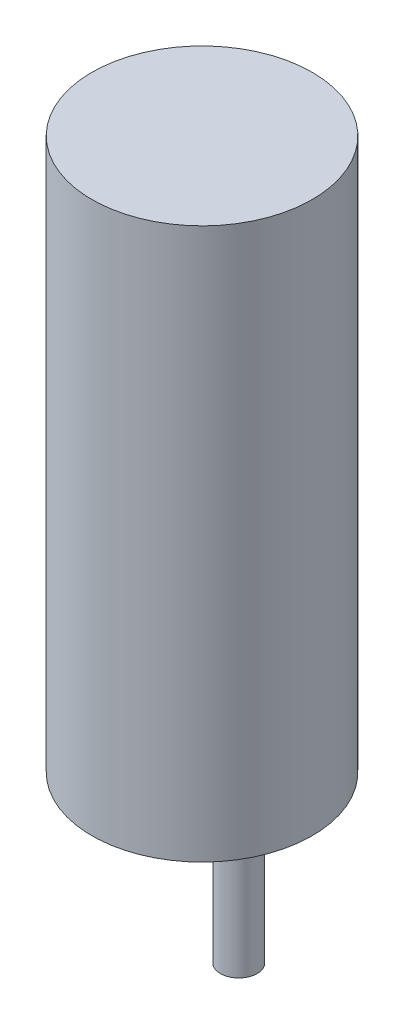
ISO-10303-21;
HEADER;
FILE_DESCRIPTION(('STEP AP214'),'2;1');
FILE_NAME('part.step','',(''),(''),'','','');
FILE_SCHEMA(('AUTOMOTIVE_DESIGN { 1 0 10303 214 1 1 1 1 }'));
ENDSEC;
DATA;
#1=APPLICATION_CONTEXT('core data for automotive mechanical design processes');
#2=APPLICATION_PROTOCOL_DEFINITION('international standard','automotive_design',2000,#1);
#3=PRODUCT_CONTEXT('',#1,'mechanical');
#4=PRODUCT('Part','Part','',(#3));
#5=PRODUCT_RELATED_PRODUCT_CATEGORY('part','',(#4));
#6=PRODUCT_DEFINITION_FORMATION('','',#4);
#7=PRODUCT_DEFINITION_CONTEXT('part definition',#1,'design');
#8=PRODUCT_DEFINITION('design','',#6,#7);
#9=PRODUCT_DEFINITION_SHAPE('','',#8);
#10=(LENGTH_UNIT() NAMED_UNIT(*) SI_UNIT(.MILLI.,.METRE.));
#11=(NAMED_UNIT(*) PLANE_ANGLE_UNIT() SI_UNIT($,.RADIAN.));
#12=(NAMED_UNIT(*) SI_UNIT($,.STERADIAN.) SOLID_ANGLE_UNIT());
#13=UNCERTAINTY_MEASURE_WITH_UNIT(LENGTH_MEASURE(1.E-05),#10,'distance_accuracy_value','');
#14=(GEOMETRIC_REPRESENTATION_CONTEXT(3) GLOBAL_UNCERTAINTY_ASSIGNED_CONTEXT((#13)) GLOBAL_UNIT_ASSIGNED_CONTEXT((#10,
#11,#12)) REPRESENTATION_CONTEXT('',''));
#15=CARTESIAN_POINT('',(0.,0.,0.));
#16=DIRECTION('',(0.,0.,1.));
#17=DIRECTION('',(1.,0.,0.));
#18=AXIS2_PLACEMENT_3D('',#15,#16,#17);
#19=CARTESIAN_POINT('',(0.,90.,0.));
#20=DIRECTION('',(0.,-1.,0.));
#21=DIRECTION('',(0.,0.,-1.));
#22=AXIS2_PLACEMENT_3D('',#19,#20,#21);
#23=CYLINDRICAL_SURFACE('',#22,18.);
#24=CARTESIAN_POINT('',(0.,90.,0.));
#25=DIRECTION('',(0.,1.,0.));
#26=DIRECTION('',(0.,0.,1.));
#27=AXIS2_PLACEMENT_3D('',#24,#25,#26);
#28=CIRCLE('',#27,18.);
#29=CARTESIAN_POINT('',(0.,90.,-18.));
#30=VERTEX_POINT('',#29);
#31=EDGE_CURVE('E41',#30,#30,#28,.T.);
#32=CARTESIAN_POINT('',(0.,0.,0.));
#33=DIRECTION('',(0.,1.,0.));
#34=DIRECTION('',(0.,0.,1.));
#35=AXIS2_PLACEMENT_3D('',#32,#33,#34);
#36=CIRCLE('',#35,18.);
#37=CARTESIAN_POINT('',(0.,0.,-18.));
#38=VERTEX_POINT('',#37);
#39=EDGE_CURVE('E45',#38,#38,#36,.T.);
#40=CARTESIAN_POINT('',(0.,90.,-18.));
#41=CARTESIAN_POINT('',(0.,89.0625,-18.));
#42=CARTESIAN_POINT('',(0.,88.125,-18.));
#43=CARTESIAN_POINT('',(0.,86.25,-18.));
#44=CARTESIAN_POINT('',(0.,85.3125,-18.));
#45=CARTESIAN_POINT('',(0.,83.4375,-18.));
#46=CARTESIAN_POINT('',(0.,82.5,-18.));
#47=CARTESIAN_POINT('',(0.,80.625,-18.));
#48=CARTESIAN_POINT('',(0.,79.6875,-18.));
#49=CARTESIAN_POINT('',(0.,77.8125,-18.));
#50=CARTESIAN_POINT('',(0.,76.875,-18.));
#51=CARTESIAN_POINT('',(0.,75.,-18.));
#52=CARTESIAN_POINT('',(0.,74.0625,-18.));
#53=CARTESIAN_POINT('',(0.,72.1875,-18.));
#54=CARTESIAN_POINT('',(0.,71.25,-18.));
#55=CARTESIAN_POINT('',(0.,69.375,-18.));
#56=CARTESIAN_POINT('',(0.,68.4375,-18.));
#57=CARTESIAN_POINT('',(0.,66.5625,-18.));
#58=CARTESIAN_POINT('',(0.,65.625,-18.));
#59=CARTESIAN_POINT('',(0.,63.75,-18.));
#60=CARTESIAN_POINT('',(0.,62.8125,-18.));
#61=CARTESIAN_POINT('',(0.,60.9375,-18.));
#62=CARTESIAN_POINT('',(0.,60.,-18.));
#63=CARTESIAN_POINT('',(0.,58.125,-18.));
#64=CARTESIAN_POINT('',(0.,57.1875,-18.));
#65=CARTESIAN_POINT('',(0.,55.3125,-18.));
#66=CARTESIAN_POINT('',(0.,54.375,-18.));
#67=CARTESIAN_POINT('',(0.,52.5,-18.));
#68=CARTESIAN_POINT('',(0.,51.5625,-18.));
#69=CARTESIAN_POINT('',(0.,49.6875,-18.));
#70=CARTESIAN_POINT('',(0.,48.75,-18.));
#71=CARTESIAN_POINT('',(0.,46.875,-18.));
#72=CARTESIAN_POINT('',(0.,45.9375,-18.));
#73=CARTESIAN_POINT('',(0.,44.0625,-18.));
#74=CARTESIAN_POINT('',(0.,43.125,-18.));
#75=CARTESIAN_POINT('',(0.,41.25,-18.));
#76=CARTESIAN_POINT('',(0.,40.3125,-18.));
#77=CARTESIAN_POINT('',(0.,38.4375,-18.));
#78=CARTESIAN_POINT('',(0.,37.5,-18.));
#79=CARTESIAN_POINT('',(0.,35.625,-18.));
#80=CARTESIAN_POINT('',(0.,34.6875,-18.));
#81=CARTESIAN_POINT('',(0.,32.8125,-18.));
#82=CARTESIAN_POINT('',(0.,31.875,-18.));
#83=CARTESIAN_POINT('',(0.,30.,-18.));
#84=CARTESIAN_POINT('',(0.,29.0625,-18.));
#85=CARTESIAN_POINT('',(0.,27.1875,-18.));
#86=CARTESIAN_POINT('',(0.,26.25,-18.));
#87=CARTESIAN_POINT('',(0.,24.375,-18.));
#88=CARTESIAN_POINT('',(0.,23.4375,-18.));
#89=CARTESIAN_POINT('',(0.,21.5625,-18.));
#90=CARTESIAN_POINT('',(0.,20.625,-18.));
#91=CARTESIAN_POINT('',(0.,18.75,-18.));
#92=CARTESIAN_POINT('',(0.,17.8125,-18.));
#93=CARTESIAN_POINT('',(0.,15.9375,-18.));
#94=CARTESIAN_POINT('',(0.,15.,-18.));
#95=CARTESIAN_POINT('',(0.,13.125,-18.));
#96=CARTESIAN_POINT('',(0.,12.1875,-18.));
#97=CARTESIAN_POINT('',(0.,10.3125,-18.));
#98=CARTESIAN_POINT('',(0.,9.37499999999999,-18.));
#99=CARTESIAN_POINT('',(0.,7.49999999999999,-18.));
#100=CARTESIAN_POINT('',(0.,6.56249999999999,-18.));
#101=CARTESIAN_POINT('',(0.,4.68749999999999,-18.));
#102=CARTESIAN_POINT('',(0.,3.74999999999998,-18.));
#103=CARTESIAN_POINT('',(0.,1.87499999999998,-18.));
#104=CARTESIAN_POINT('',(0.,0.937499999999986,-18.));
#105=CARTESIAN_POINT('',(0.,0.,-18.));
#106=B_SPLINE_CURVE_WITH_KNOTS('',3,(#40,#41,#42,#43,#44,#45,#46,#47,#48,#49,#50,#51,#52,#53,
#54,#55,#56,#57,#58,#59,#60,#61,#62,#63,#64,#65,#66,#67,#68,#69,#70,#71,#72,#73,#74,#75,#76,#77,
#78,#79,#80,#81,#82,#83,#84,#85,#86,#87,#88,#89,#90,#91,#92,#93,#94,#95,#96,#97,#98,#99,#100,
#101,#102,#103,#104,#105),.UNSPECIFIED.,.F.,.F.,(4,2,2,2,2,2,2,2,2,2,2,2,2,2,2,2,2,2,2,2,2,2,2,
2,2,2,2,2,2,2,2,2,4),(0.,2.81250000000001,5.62500000000001,8.43750000000001,11.25,14.0625,
16.875,19.6875,22.5,25.3125,28.125,30.9375,33.75,36.5625,39.375,42.1875,45.,47.8125,50.625,
53.4375,56.25,59.0625,61.875,64.6875,67.5,70.3125,73.125,75.9375,78.75,81.5625,84.375,87.1875,
90.),.UNSPECIFIED.);
#107=EDGE_CURVE('BSEAM35',#30,#38,#106,.T.);
#108=ORIENTED_EDGE('',*,*,#31,.F.);
#109=ORIENTED_EDGE('',*,*,#39,.T.);
#110=ORIENTED_EDGE('',*,*,#107,.T.);
#111=ORIENTED_EDGE('',*,*,#107,.F.);
#112=EDGE_LOOP('',(#108,#110,#109,#111));
#113=FACE_BOUND('',#112,.T.);
#114=ADVANCED_FACE('F35',(#113),#23,.T.);
#115=CARTESIAN_POINT('',(0.,90.,0.));
#116=DIRECTION('',(0.,1.,0.));
#117=DIRECTION('',(0.,0.,1.));
#118=AXIS2_PLACEMENT_3D('',#115,#116,#117);
#119=PLANE('',#118);
#120=ORIENTED_EDGE('',*,*,#31,.T.);
#121=EDGE_LOOP('',(#120));
#122=FACE_BOUND('',#121,.T.);
#123=ADVANCED_FACE('F66',(#122),#119,.T.);
#124=CARTESIAN_POINT('',(0.,0.,0.));
#125=DIRECTION('',(0.,1.,0.));
#126=DIRECTION('',(0.,0.,1.));
#127=AXIS2_PLACEMENT_3D('',#124,#125,#126);
#128=PLANE('',#127);
#129=CARTESIAN_POINT('',(0.,0.,-6.));
#130=DIRECTION('',(0.,1.,0.));
#131=DIRECTION('',(0.,0.,1.));
#132=AXIS2_PLACEMENT_3D('',#129,#130,#131);
#133=CIRCLE('',#132,3.);
#134=CARTESIAN_POINT('',(0.,0.,-3.));
#135=VERTEX_POINT('',#134);
#136=EDGE_CURVE('E10',#135,#135,#133,.F.);
#137=ORIENTED_EDGE('',*,*,#136,.F.);
#138=EDGE_LOOP('',(#137));
#139=FACE_BOUND('',#138,.T.);
#140=ORIENTED_EDGE('',*,*,#39,.F.);
#141=EDGE_LOOP('',(#140));
#142=FACE_BOUND('',#141,.T.);
#143=ADVANCED_FACE('F59',(#139,#142),#128,.F.);
#144=CARTESIAN_POINT('',(0.,-30.,-6.));
#145=DIRECTION('',(0.,1.,0.));
#146=DIRECTION('',(0.,0.,1.));
#147=AXIS2_PLACEMENT_3D('',#144,#145,#146);
#148=CYLINDRICAL_SURFACE('',#147,3.);
#149=CARTESIAN_POINT('',(0.,-30.,-6.));
#150=DIRECTION('',(0.,-1.,0.));
#151=DIRECTION('',(0.,0.,-1.));
#152=AXIS2_PLACEMENT_3D('',#149,#150,#151);
#153=CIRCLE('',#152,3.);
#154=CARTESIAN_POINT('',(0.,-30.,-9.));
#155=VERTEX_POINT('',#154);
#156=EDGE_CURVE('E50',#155,#155,#153,.T.);
#157=ORIENTED_EDGE('',*,*,#156,.F.);
#158=EDGE_LOOP('',(#157));
#159=FACE_BOUND('',#158,.T.);
#160=ORIENTED_EDGE('',*,*,#136,.T.);
#161=EDGE_LOOP('',(#160));
#162=FACE_BOUND('',#161,.T.);
#163=ADVANCED_FACE('F57',(#159,#162),#148,.T.);
#164=CARTESIAN_POINT('',(0.,-30.,-6.));
#165=DIRECTION('',(0.,-1.,0.));
#166=DIRECTION('',(0.,0.,-1.));
#167=AXIS2_PLACEMENT_3D('',#164,#165,#166);
#168=PLANE('',#167);
#169=ORIENTED_EDGE('',*,*,#156,.T.);
#170=EDGE_LOOP('',(#169));
#171=FACE_BOUND('',#170,.T.);
#172=ADVANCED_FACE('F55',(#171),#168,.T.);
#173=CLOSED_SHELL('',(#114,#123,#143,#163,#172));
#174=MANIFOLD_SOLID_BREP('B2',#173);
#175=ADVANCED_BREP_SHAPE_REPRESENTATION('',(#18,#174),#14);
#176=SHAPE_DEFINITION_REPRESENTATION(#9,#175);
ENDSEC;
END-ISO-10303-21;
